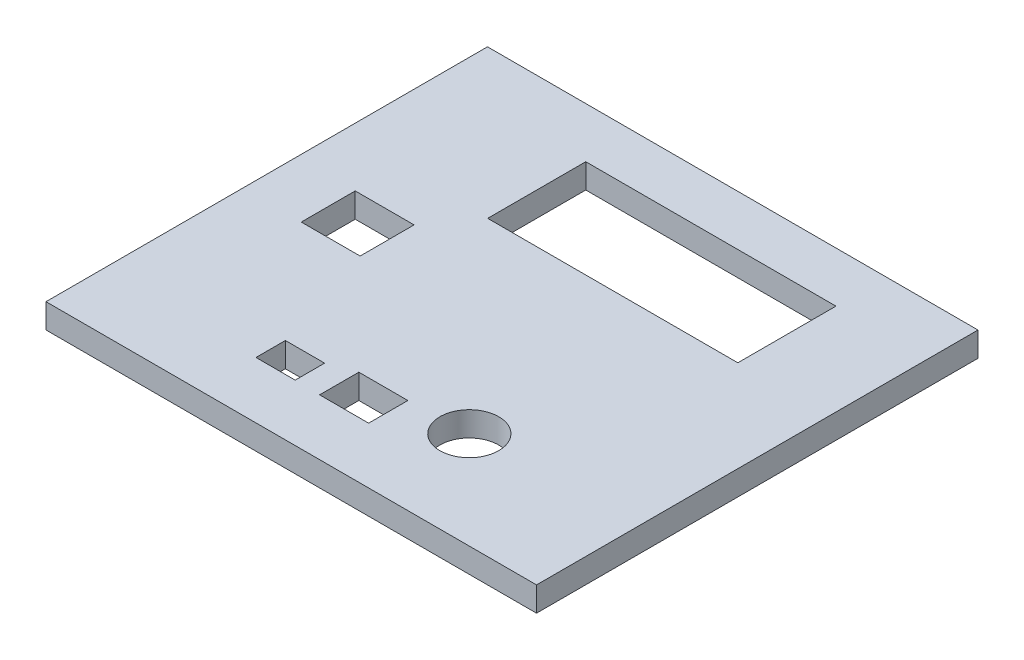
ISO-10303-21;
HEADER;
FILE_DESCRIPTION(('STEP AP214'),'2;1');
FILE_NAME('part.step','',(''),(''),'','','');
FILE_SCHEMA(('AUTOMOTIVE_DESIGN { 1 0 10303 214 1 1 1 1 }'));
ENDSEC;
DATA;
#1=APPLICATION_CONTEXT('core data for automotive mechanical design processes');
#2=APPLICATION_PROTOCOL_DEFINITION('international standard','automotive_design',2000,#1);
#3=PRODUCT_CONTEXT('',#1,'mechanical');
#4=PRODUCT('Part','Part','',(#3));
#5=PRODUCT_RELATED_PRODUCT_CATEGORY('part','',(#4));
#6=PRODUCT_DEFINITION_FORMATION('','',#4);
#7=PRODUCT_DEFINITION_CONTEXT('part definition',#1,'design');
#8=PRODUCT_DEFINITION('design','',#6,#7);
#9=PRODUCT_DEFINITION_SHAPE('','',#8);
#10=(LENGTH_UNIT() NAMED_UNIT(*) SI_UNIT(.MILLI.,.METRE.));
#11=(NAMED_UNIT(*) PLANE_ANGLE_UNIT() SI_UNIT($,.RADIAN.));
#12=(NAMED_UNIT(*) SI_UNIT($,.STERADIAN.) SOLID_ANGLE_UNIT());
#13=UNCERTAINTY_MEASURE_WITH_UNIT(LENGTH_MEASURE(1.E-05),#10,'distance_accuracy_value','');
#14=(GEOMETRIC_REPRESENTATION_CONTEXT(3) GLOBAL_UNCERTAINTY_ASSIGNED_CONTEXT((#13)) GLOBAL_UNIT_ASSIGNED_CONTEXT((#10,
#11,#12)) REPRESENTATION_CONTEXT('',''));
#15=CARTESIAN_POINT('',(0.,0.,0.));
#16=DIRECTION('',(0.,0.,1.));
#17=DIRECTION('',(1.,0.,0.));
#18=AXIS2_PLACEMENT_3D('',#15,#16,#17);
#19=CARTESIAN_POINT('',(0.,5.,0.));
#20=DIRECTION('',(0.,-1.,0.));
#21=DIRECTION('',(0.,0.,-1.));
#22=AXIS2_PLACEMENT_3D('',#19,#20,#21);
#23=PLANE('',#22);
#24=DIRECTION('',(1.,0.,0.));
#25=VECTOR('',#24,1.);
#26=CARTESIAN_POINT('',(-19.6931100810571,5.,-14.7327112730972));
#27=LINE('',#26,#25);
#28=CARTESIAN_POINT('',(-19.6931100810571,5.,-14.7327112730972));
#29=VERTEX_POINT('',#28);
#30=CARTESIAN_POINT('',(31.3068899189429,5.,-14.7327112730972));
#31=VERTEX_POINT('',#30);
#32=EDGE_CURVE('E193',#29,#31,#27,.T.);
#33=ORIENTED_EDGE('',*,*,#32,.F.);
#34=DIRECTION('',(0.,0.,-1.));
#35=VECTOR('',#34,1.);
#36=CARTESIAN_POINT('',(-19.6931100810571,5.,-14.7327112730972));
#37=LINE('',#36,#35);
#38=CARTESIAN_POINT('',(-19.6931100810571,5.,-34.7327112730972));
#39=VERTEX_POINT('',#38);
#40=EDGE_CURVE('E187',#29,#39,#37,.T.);
#41=ORIENTED_EDGE('',*,*,#40,.T.);
#42=DIRECTION('',(1.,0.,0.));
#43=VECTOR('',#42,1.);
#44=CARTESIAN_POINT('',(-19.6931100810571,5.,-34.7327112730972));
#45=LINE('',#44,#43);
#46=CARTESIAN_POINT('',(31.3068899189429,5.,-34.7327112730972));
#47=VERTEX_POINT('',#46);
#48=EDGE_CURVE('E196',#39,#47,#45,.T.);
#49=ORIENTED_EDGE('',*,*,#48,.T.);
#50=DIRECTION('',(0.,0.,-1.));
#51=VECTOR('',#50,1.);
#52=CARTESIAN_POINT('',(31.3068899189429,5.,-14.7327112730972));
#53=LINE('',#52,#51);
#54=EDGE_CURVE('E201',#31,#47,#53,.T.);
#55=ORIENTED_EDGE('',*,*,#54,.F.);
#56=EDGE_LOOP('',(#33,#41,#49,#55));
#57=FACE_BOUND('',#56,.T.);
#58=DIRECTION('',(1.,0.,0.));
#59=VECTOR('',#58,1.);
#60=CARTESIAN_POINT('',(-18.7489198716913,5.,33.4489582294186));
#61=LINE('',#60,#59);
#62=CARTESIAN_POINT('',(-18.7489198716913,5.,33.4489582294186));
#63=VERTEX_POINT('',#62);
#64=CARTESIAN_POINT('',(-10.7489198716913,5.,33.4489582294186));
#65=VERTEX_POINT('',#64);
#66=EDGE_CURVE('E248',#63,#65,#61,.T.);
#67=ORIENTED_EDGE('',*,*,#66,.F.);
#68=DIRECTION('',(0.,0.,-1.));
#69=VECTOR('',#68,1.);
#70=CARTESIAN_POINT('',(-18.7489198716913,5.,33.4489582294186));
#71=LINE('',#70,#69);
#72=CARTESIAN_POINT('',(-18.7489198716913,5.,27.4489582294186));
#73=VERTEX_POINT('',#72);
#74=EDGE_CURVE('E262',#63,#73,#71,.T.);
#75=ORIENTED_EDGE('',*,*,#74,.T.);
#76=DIRECTION('',(1.,0.,0.));
#77=VECTOR('',#76,1.);
#78=CARTESIAN_POINT('',(-18.7489198716913,5.,27.4489582294186));
#79=LINE('',#78,#77);
#80=CARTESIAN_POINT('',(-10.7489198716913,5.,27.4489582294186));
#81=VERTEX_POINT('',#80);
#82=EDGE_CURVE('E276',#73,#81,#79,.T.);
#83=ORIENTED_EDGE('',*,*,#82,.T.);
#84=DIRECTION('',(0.,0.,-1.));
#85=VECTOR('',#84,1.);
#86=CARTESIAN_POINT('',(-10.7489198716913,5.,33.4489582294186));
#87=LINE('',#86,#85);
#88=EDGE_CURVE('E273',#65,#81,#87,.T.);
#89=ORIENTED_EDGE('',*,*,#88,.F.);
#90=EDGE_LOOP('',(#67,#75,#83,#89));
#91=FACE_BOUND('',#90,.T.);
#92=DIRECTION('',(1.,0.,0.));
#93=VECTOR('',#92,1.);
#94=CARTESIAN_POINT('',(-5.6651412561945,5.,33.5605778106871));
#95=LINE('',#94,#93);
#96=CARTESIAN_POINT('',(-5.6651412561945,5.,33.5605778106871));
#97=VERTEX_POINT('',#96);
#98=CARTESIAN_POINT('',(4.3348587438055,5.,33.5605778106871));
#99=VERTEX_POINT('',#98);
#100=EDGE_CURVE('E330',#97,#99,#95,.T.);
#101=ORIENTED_EDGE('',*,*,#100,.F.);
#102=DIRECTION('',(0.,0.,-1.));
#103=VECTOR('',#102,1.);
#104=CARTESIAN_POINT('',(-5.6651412561945,5.,33.5605778106871));
#105=LINE('',#104,#103);
#106=CARTESIAN_POINT('',(-5.6651412561945,5.,25.5605778106871));
#107=VERTEX_POINT('',#106);
#108=EDGE_CURVE('E344',#97,#107,#105,.T.);
#109=ORIENTED_EDGE('',*,*,#108,.T.);
#110=DIRECTION('',(1.,0.,0.));
#111=VECTOR('',#110,1.);
#112=CARTESIAN_POINT('',(-5.6651412561945,5.,25.5605778106871));
#113=LINE('',#112,#111);
#114=CARTESIAN_POINT('',(4.3348587438055,5.,25.5605778106871));
#115=VERTEX_POINT('',#114);
#116=EDGE_CURVE('E360',#107,#115,#113,.T.);
#117=ORIENTED_EDGE('',*,*,#116,.T.);
#118=DIRECTION('',(0.,0.,-1.));
#119=VECTOR('',#118,1.);
#120=CARTESIAN_POINT('',(4.3348587438055,5.,33.5605778106871));
#121=LINE('',#120,#119);
#122=EDGE_CURVE('E356',#99,#115,#121,.T.);
#123=ORIENTED_EDGE('',*,*,#122,.F.);
#124=EDGE_LOOP('',(#101,#109,#117,#123));
#125=FACE_BOUND('',#124,.T.);
#126=DIRECTION('',(1.,0.,0.));
#127=VECTOR('',#126,1.);
#128=CARTESIAN_POINT('',(-38.0373770058773,5.,4.92327752026423));
#129=LINE('',#128,#127);
#130=CARTESIAN_POINT('',(-38.0373770058773,5.,4.92327752026423));
#131=VERTEX_POINT('',#130);
#132=CARTESIAN_POINT('',(-26.0373770058773,5.,4.92327752026423));
#133=VERTEX_POINT('',#132);
#134=EDGE_CURVE('E287',#131,#133,#129,.T.);
#135=ORIENTED_EDGE('',*,*,#134,.F.);
#136=DIRECTION('',(0.,0.,-1.));
#137=VECTOR('',#136,1.);
#138=CARTESIAN_POINT('',(-38.0373770058773,5.,4.92327752026423));
#139=LINE('',#138,#137);
#140=CARTESIAN_POINT('',(-38.0373770058773,5.,-6.07672247973577));
#141=VERTEX_POINT('',#140);
#142=EDGE_CURVE('E303',#131,#141,#139,.T.);
#143=ORIENTED_EDGE('',*,*,#142,.T.);
#144=DIRECTION('',(1.,0.,0.));
#145=VECTOR('',#144,1.);
#146=CARTESIAN_POINT('',(-38.0373770058773,5.,-6.07672247973577));
#147=LINE('',#146,#145);
#148=CARTESIAN_POINT('',(-26.0373770058773,5.,-6.07672247973577));
#149=VERTEX_POINT('',#148);
#150=EDGE_CURVE('E319',#141,#149,#147,.T.);
#151=ORIENTED_EDGE('',*,*,#150,.T.);
#152=DIRECTION('',(0.,0.,-1.));
#153=VECTOR('',#152,1.);
#154=CARTESIAN_POINT('',(-26.0373770058773,5.,4.92327752026423));
#155=LINE('',#154,#153);
#156=EDGE_CURVE('E315',#133,#149,#155,.T.);
#157=ORIENTED_EDGE('',*,*,#156,.F.);
#158=EDGE_LOOP('',(#135,#143,#151,#157));
#159=FACE_BOUND('',#158,.T.);
#160=DIRECTION('',(0.,0.,-1.));
#161=VECTOR('',#160,1.);
#162=CARTESIAN_POINT('',(-50.,5.,45.));
#163=LINE('',#162,#161);
#164=CARTESIAN_POINT('',(-50.,5.,45.));
#165=VERTEX_POINT('',#164);
#166=CARTESIAN_POINT('',(-50.,5.,-45.));
#167=VERTEX_POINT('',#166);
#168=EDGE_CURVE('E367',#165,#167,#163,.T.);
#169=ORIENTED_EDGE('',*,*,#168,.F.);
#170=DIRECTION('',(1.,0.,0.));
#171=VECTOR('',#170,1.);
#172=CARTESIAN_POINT('',(-50.,5.,45.));
#173=LINE('',#172,#171);
#174=CARTESIAN_POINT('',(50.,5.,45.));
#175=VERTEX_POINT('',#174);
#176=EDGE_CURVE('E379',#165,#175,#173,.T.);
#177=ORIENTED_EDGE('',*,*,#176,.T.);
#178=DIRECTION('',(0.,0.,-1.));
#179=VECTOR('',#178,1.);
#180=CARTESIAN_POINT('',(50.,5.,45.));
#181=LINE('',#180,#179);
#182=CARTESIAN_POINT('',(50.,5.,-45.));
#183=VERTEX_POINT('',#182);
#184=EDGE_CURVE('E376',#175,#183,#181,.T.);
#185=ORIENTED_EDGE('',*,*,#184,.T.);
#186=DIRECTION('',(1.,0.,0.));
#187=VECTOR('',#186,1.);
#188=CARTESIAN_POINT('',(-50.,5.,-45.));
#189=LINE('',#188,#187);
#190=EDGE_CURVE('E371',#167,#183,#189,.T.);
#191=ORIENTED_EDGE('',*,*,#190,.F.);
#192=EDGE_LOOP('',(#169,#177,#185,#191));
#193=FACE_BOUND('',#192,.T.);
#194=CARTESIAN_POINT('',(16.4558865060888,5.,25.155924863816));
#195=DIRECTION('',(0.,1.,0.));
#196=DIRECTION('',(0.,0.,1.));
#197=AXIS2_PLACEMENT_3D('',#194,#195,#196);
#198=CIRCLE('',#197,6.);
#199=CARTESIAN_POINT('',(16.4558865060888,5.,31.155924863816));
#200=VERTEX_POINT('',#199);
#201=EDGE_CURVE('E239',#200,#200,#198,.T.);
#202=ORIENTED_EDGE('',*,*,#201,.F.);
#203=EDGE_LOOP('',(#202));
#204=FACE_BOUND('',#203,.T.);
#205=ADVANCED_FACE('F43',(#57,#91,#125,#159,#193,#204),#23,.F.);
#206=CARTESIAN_POINT('',(0.,0.,0.));
#207=DIRECTION('',(0.,-1.,0.));
#208=DIRECTION('',(0.,0.,-1.));
#209=AXIS2_PLACEMENT_3D('',#206,#207,#208);
#210=PLANE('',#209);
#211=DIRECTION('',(0.,0.,-1.));
#212=VECTOR('',#211,1.);
#213=CARTESIAN_POINT('',(-19.6931100810571,0.,-14.7327112730972));
#214=LINE('',#213,#212);
#215=CARTESIAN_POINT('',(-19.6931100810571,0.,-14.7327112730972));
#216=VERTEX_POINT('',#215);
#217=CARTESIAN_POINT('',(-19.6931100810571,0.,-34.7327112730972));
#218=VERTEX_POINT('',#217);
#219=EDGE_CURVE('E190',#216,#218,#214,.T.);
#220=ORIENTED_EDGE('',*,*,#219,.F.);
#221=DIRECTION('',(1.,0.,0.));
#222=VECTOR('',#221,1.);
#223=CARTESIAN_POINT('',(-19.6931100810571,0.,-14.7327112730972));
#224=LINE('',#223,#222);
#225=CARTESIAN_POINT('',(31.3068899189429,0.,-14.7327112730972));
#226=VERTEX_POINT('',#225);
#227=EDGE_CURVE('E205',#216,#226,#224,.T.);
#228=ORIENTED_EDGE('',*,*,#227,.T.);
#229=DIRECTION('',(0.,0.,-1.));
#230=VECTOR('',#229,1.);
#231=CARTESIAN_POINT('',(31.3068899189429,0.,-14.7327112730972));
#232=LINE('',#231,#230);
#233=CARTESIAN_POINT('',(31.3068899189429,0.,-34.7327112730972));
#234=VERTEX_POINT('',#233);
#235=EDGE_CURVE('E209',#226,#234,#232,.T.);
#236=ORIENTED_EDGE('',*,*,#235,.T.);
#237=DIRECTION('',(1.,0.,0.));
#238=VECTOR('',#237,1.);
#239=CARTESIAN_POINT('',(-19.6931100810571,0.,-34.7327112730972));
#240=LINE('',#239,#238);
#241=EDGE_CURVE('E218',#218,#234,#240,.T.);
#242=ORIENTED_EDGE('',*,*,#241,.F.);
#243=EDGE_LOOP('',(#220,#228,#236,#242));
#244=FACE_BOUND('',#243,.T.);
#245=DIRECTION('',(0.,0.,-1.));
#246=VECTOR('',#245,1.);
#247=CARTESIAN_POINT('',(-18.7489198716913,0.,33.4489582294186));
#248=LINE('',#247,#246);
#249=CARTESIAN_POINT('',(-18.7489198716913,0.,33.4489582294186));
#250=VERTEX_POINT('',#249);
#251=CARTESIAN_POINT('',(-18.7489198716913,0.,27.4489582294186));
#252=VERTEX_POINT('',#251);
#253=EDGE_CURVE('E243',#250,#252,#248,.T.);
#254=ORIENTED_EDGE('',*,*,#253,.F.);
#255=DIRECTION('',(1.,0.,0.));
#256=VECTOR('',#255,1.);
#257=CARTESIAN_POINT('',(-18.7489198716913,0.,33.4489582294186));
#258=LINE('',#257,#256);
#259=CARTESIAN_POINT('',(-10.7489198716913,0.,33.4489582294186));
#260=VERTEX_POINT('',#259);
#261=EDGE_CURVE('E257',#250,#260,#258,.T.);
#262=ORIENTED_EDGE('',*,*,#261,.T.);
#263=DIRECTION('',(0.,0.,-1.));
#264=VECTOR('',#263,1.);
#265=CARTESIAN_POINT('',(-10.7489198716913,0.,33.4489582294186));
#266=LINE('',#265,#264);
#267=CARTESIAN_POINT('',(-10.7489198716913,0.,27.4489582294186));
#268=VERTEX_POINT('',#267);
#269=EDGE_CURVE('E261',#260,#268,#266,.T.);
#270=ORIENTED_EDGE('',*,*,#269,.T.);
#271=DIRECTION('',(1.,0.,0.));
#272=VECTOR('',#271,1.);
#273=CARTESIAN_POINT('',(-18.7489198716913,0.,27.4489582294186));
#274=LINE('',#273,#272);
#275=EDGE_CURVE('E266',#252,#268,#274,.T.);
#276=ORIENTED_EDGE('',*,*,#275,.F.);
#277=EDGE_LOOP('',(#254,#262,#270,#276));
#278=FACE_BOUND('',#277,.T.);
#279=DIRECTION('',(0.,0.,-1.));
#280=VECTOR('',#279,1.);
#281=CARTESIAN_POINT('',(-50.,0.,45.));
#282=LINE('',#281,#280);
#283=CARTESIAN_POINT('',(-50.,0.,45.));
#284=VERTEX_POINT('',#283);
#285=CARTESIAN_POINT('',(-50.,0.,-45.));
#286=VERTEX_POINT('',#285);
#287=EDGE_CURVE('E228',#284,#286,#282,.T.);
#288=ORIENTED_EDGE('',*,*,#287,.T.);
#289=DIRECTION('',(1.,0.,0.));
#290=VECTOR('',#289,1.);
#291=CARTESIAN_POINT('',(-50.,0.,-45.));
#292=LINE('',#291,#290);
#293=CARTESIAN_POINT('',(50.,0.,-45.));
#294=VERTEX_POINT('',#293);
#295=EDGE_CURVE('E385',#286,#294,#292,.T.);
#296=ORIENTED_EDGE('',*,*,#295,.T.);
#297=DIRECTION('',(0.,0.,-1.));
#298=VECTOR('',#297,1.);
#299=CARTESIAN_POINT('',(50.,0.,45.));
#300=LINE('',#299,#298);
#301=CARTESIAN_POINT('',(50.,0.,45.));
#302=VERTEX_POINT('',#301);
#303=EDGE_CURVE('E389',#302,#294,#300,.T.);
#304=ORIENTED_EDGE('',*,*,#303,.F.);
#305=DIRECTION('',(1.,0.,0.));
#306=VECTOR('',#305,1.);
#307=CARTESIAN_POINT('',(-50.,0.,45.));
#308=LINE('',#307,#306);
#309=EDGE_CURVE('E372',#284,#302,#308,.T.);
#310=ORIENTED_EDGE('',*,*,#309,.F.);
#311=EDGE_LOOP('',(#288,#296,#304,#310));
#312=FACE_BOUND('',#311,.T.);
#313=DIRECTION('',(0.,0.,-1.));
#314=VECTOR('',#313,1.);
#315=CARTESIAN_POINT('',(-38.0373770058773,0.,4.92327752026423));
#316=LINE('',#315,#314);
#317=CARTESIAN_POINT('',(-38.0373770058773,0.,4.92327752026423));
#318=VERTEX_POINT('',#317);
#319=CARTESIAN_POINT('',(-38.0373770058773,0.,-6.07672247973577));
#320=VERTEX_POINT('',#319);
#321=EDGE_CURVE('E219',#318,#320,#316,.T.);
#322=ORIENTED_EDGE('',*,*,#321,.F.);
#323=DIRECTION('',(1.,0.,0.));
#324=VECTOR('',#323,1.);
#325=CARTESIAN_POINT('',(-38.0373770058773,0.,4.92327752026423));
#326=LINE('',#325,#324);
#327=CARTESIAN_POINT('',(-26.0373770058773,0.,4.92327752026423));
#328=VERTEX_POINT('',#327);
#329=EDGE_CURVE('E298',#318,#328,#326,.T.);
#330=ORIENTED_EDGE('',*,*,#329,.T.);
#331=DIRECTION('',(0.,0.,-1.));
#332=VECTOR('',#331,1.);
#333=CARTESIAN_POINT('',(-26.0373770058773,0.,4.92327752026423));
#334=LINE('',#333,#332);
#335=CARTESIAN_POINT('',(-26.0373770058773,0.,-6.07672247973577));
#336=VERTEX_POINT('',#335);
#337=EDGE_CURVE('E302',#328,#336,#334,.T.);
#338=ORIENTED_EDGE('',*,*,#337,.T.);
#339=DIRECTION('',(1.,0.,0.));
#340=VECTOR('',#339,1.);
#341=CARTESIAN_POINT('',(-38.0373770058773,0.,-6.07672247973577));
#342=LINE('',#341,#340);
#343=EDGE_CURVE('E307',#320,#336,#342,.T.);
#344=ORIENTED_EDGE('',*,*,#343,.F.);
#345=EDGE_LOOP('',(#322,#330,#338,#344));
#346=FACE_BOUND('',#345,.T.);
#347=DIRECTION('',(0.,0.,-1.));
#348=VECTOR('',#347,1.);
#349=CARTESIAN_POINT('',(-5.6651412561945,0.,33.5605778106871));
#350=LINE('',#349,#348);
#351=CARTESIAN_POINT('',(-5.6651412561945,0.,33.5605778106871));
#352=VERTEX_POINT('',#351);
#353=CARTESIAN_POINT('',(-5.6651412561945,0.,25.5605778106871));
#354=VERTEX_POINT('',#353);
#355=EDGE_CURVE('E297',#352,#354,#350,.T.);
#356=ORIENTED_EDGE('',*,*,#355,.F.);
#357=DIRECTION('',(1.,0.,0.));
#358=VECTOR('',#357,1.);
#359=CARTESIAN_POINT('',(-5.6651412561945,0.,33.5605778106871));
#360=LINE('',#359,#358);
#361=CARTESIAN_POINT('',(4.3348587438055,0.,33.5605778106871));
#362=VERTEX_POINT('',#361);
#363=EDGE_CURVE('E339',#352,#362,#360,.T.);
#364=ORIENTED_EDGE('',*,*,#363,.T.);
#365=DIRECTION('',(0.,0.,-1.));
#366=VECTOR('',#365,1.);
#367=CARTESIAN_POINT('',(4.3348587438055,0.,33.5605778106871));
#368=LINE('',#367,#366);
#369=CARTESIAN_POINT('',(4.3348587438055,0.,25.5605778106871));
#370=VERTEX_POINT('',#369);
#371=EDGE_CURVE('E343',#362,#370,#368,.T.);
#372=ORIENTED_EDGE('',*,*,#371,.T.);
#373=DIRECTION('',(1.,0.,0.));
#374=VECTOR('',#373,1.);
#375=CARTESIAN_POINT('',(-5.6651412561945,0.,25.5605778106871));
#376=LINE('',#375,#374);
#377=EDGE_CURVE('E348',#354,#370,#376,.T.);
#378=ORIENTED_EDGE('',*,*,#377,.F.);
#379=EDGE_LOOP('',(#356,#364,#372,#378));
#380=FACE_BOUND('',#379,.T.);
#381=CARTESIAN_POINT('',(16.4558865060888,0.,25.155924863816));
#382=DIRECTION('',(0.,1.,0.));
#383=DIRECTION('',(0.,0.,1.));
#384=AXIS2_PLACEMENT_3D('',#381,#382,#383);
#385=CIRCLE('',#384,6.);
#386=CARTESIAN_POINT('',(16.4558865060888,0.,31.155924863816));
#387=VERTEX_POINT('',#386);
#388=EDGE_CURVE('E234',#387,#387,#385,.T.);
#389=ORIENTED_EDGE('',*,*,#388,.T.);
#390=EDGE_LOOP('',(#389));
#391=FACE_BOUND('',#390,.T.);
#392=ADVANCED_FACE('F411',(#244,#278,#312,#346,#380,#391),#210,.T.);
#393=CARTESIAN_POINT('',(-50.,5.,45.));
#394=DIRECTION('',(-1.,0.,0.));
#395=DIRECTION('',(0.,0.,1.));
#396=AXIS2_PLACEMENT_3D('',#393,#394,#395);
#397=PLANE('',#396);
#398=ORIENTED_EDGE('',*,*,#287,.F.);
#399=DIRECTION('',(0.,-1.,0.));
#400=VECTOR('',#399,1.);
#401=CARTESIAN_POINT('',(-50.,5.,45.));
#402=LINE('',#401,#400);
#403=EDGE_CURVE('E11',#165,#284,#402,.T.);
#404=ORIENTED_EDGE('',*,*,#403,.F.);
#405=ORIENTED_EDGE('',*,*,#168,.T.);
#406=DIRECTION('',(0.,-1.,0.));
#407=VECTOR('',#406,1.);
#408=CARTESIAN_POINT('',(-50.,5.,-45.));
#409=LINE('',#408,#407);
#410=EDGE_CURVE('E47',#167,#286,#409,.T.);
#411=ORIENTED_EDGE('',*,*,#410,.T.);
#412=EDGE_LOOP('',(#398,#404,#405,#411));
#413=FACE_BOUND('',#412,.T.);
#414=ADVANCED_FACE('F45',(#413),#397,.T.);
#415=CARTESIAN_POINT('',(-50.,5.,45.));
#416=DIRECTION('',(0.,0.,-1.));
#417=DIRECTION('',(-1.,0.,0.));
#418=AXIS2_PLACEMENT_3D('',#415,#416,#417);
#419=PLANE('',#418);
#420=ORIENTED_EDGE('',*,*,#309,.T.);
#421=DIRECTION('',(0.,-1.,0.));
#422=VECTOR('',#421,1.);
#423=CARTESIAN_POINT('',(50.,5.,45.));
#424=LINE('',#423,#422);
#425=EDGE_CURVE('E53',#175,#302,#424,.T.);
#426=ORIENTED_EDGE('',*,*,#425,.F.);
#427=ORIENTED_EDGE('',*,*,#176,.F.);
#428=ORIENTED_EDGE('',*,*,#403,.T.);
#429=EDGE_LOOP('',(#420,#426,#427,#428));
#430=FACE_BOUND('',#429,.T.);
#431=ADVANCED_FACE('F415',(#430),#419,.F.);
#432=CARTESIAN_POINT('',(50.,5.,45.));
#433=DIRECTION('',(-1.,0.,0.));
#434=DIRECTION('',(0.,0.,1.));
#435=AXIS2_PLACEMENT_3D('',#432,#433,#434);
#436=PLANE('',#435);
#437=ORIENTED_EDGE('',*,*,#303,.T.);
#438=DIRECTION('',(0.,-1.,0.));
#439=VECTOR('',#438,1.);
#440=CARTESIAN_POINT('',(50.,5.,-45.));
#441=LINE('',#440,#439);
#442=EDGE_CURVE('E397',#183,#294,#441,.T.);
#443=ORIENTED_EDGE('',*,*,#442,.F.);
#444=ORIENTED_EDGE('',*,*,#184,.F.);
#445=ORIENTED_EDGE('',*,*,#425,.T.);
#446=EDGE_LOOP('',(#437,#443,#444,#445));
#447=FACE_BOUND('',#446,.T.);
#448=ADVANCED_FACE('F419',(#447),#436,.F.);
#449=CARTESIAN_POINT('',(-50.,5.,-45.));
#450=DIRECTION('',(0.,0.,-1.));
#451=DIRECTION('',(-1.,0.,0.));
#452=AXIS2_PLACEMENT_3D('',#449,#450,#451);
#453=PLANE('',#452);
#454=ORIENTED_EDGE('',*,*,#295,.F.);
#455=ORIENTED_EDGE('',*,*,#410,.F.);
#456=ORIENTED_EDGE('',*,*,#190,.T.);
#457=ORIENTED_EDGE('',*,*,#442,.T.);
#458=EDGE_LOOP('',(#454,#455,#456,#457));
#459=FACE_BOUND('',#458,.T.);
#460=ADVANCED_FACE('F407',(#459),#453,.T.);
#461=CARTESIAN_POINT('',(-38.0373770058773,5.,4.92327752026423));
#462=DIRECTION('',(-1.,0.,0.));
#463=DIRECTION('',(0.,0.,1.));
#464=AXIS2_PLACEMENT_3D('',#461,#462,#463);
#465=PLANE('',#464);
#466=ORIENTED_EDGE('',*,*,#321,.T.);
#467=DIRECTION('',(0.,-1.,0.));
#468=VECTOR('',#467,1.);
#469=CARTESIAN_POINT('',(-38.0373770058773,5.,-6.07672247973577));
#470=LINE('',#469,#468);
#471=EDGE_CURVE('E283',#141,#320,#470,.T.);
#472=ORIENTED_EDGE('',*,*,#471,.F.);
#473=ORIENTED_EDGE('',*,*,#142,.F.);
#474=DIRECTION('',(0.,-1.,0.));
#475=VECTOR('',#474,1.);
#476=CARTESIAN_POINT('',(-38.0373770058773,5.,4.92327752026423));
#477=LINE('',#476,#475);
#478=EDGE_CURVE('E294',#131,#318,#477,.T.);
#479=ORIENTED_EDGE('',*,*,#478,.T.);
#480=EDGE_LOOP('',(#466,#472,#473,#479));
#481=FACE_BOUND('',#480,.T.);
#482=ADVANCED_FACE('F447',(#481),#465,.F.);
#483=CARTESIAN_POINT('',(-38.0373770058773,5.,4.92327752026423));
#484=DIRECTION('',(0.,0.,-1.));
#485=DIRECTION('',(-1.,0.,0.));
#486=AXIS2_PLACEMENT_3D('',#483,#484,#485);
#487=PLANE('',#486);
#488=ORIENTED_EDGE('',*,*,#329,.F.);
#489=ORIENTED_EDGE('',*,*,#478,.F.);
#490=ORIENTED_EDGE('',*,*,#134,.T.);
#491=DIRECTION('',(0.,-1.,0.));
#492=VECTOR('',#491,1.);
#493=CARTESIAN_POINT('',(-26.0373770058773,5.,4.92327752026423));
#494=LINE('',#493,#492);
#495=EDGE_CURVE('E291',#133,#328,#494,.T.);
#496=ORIENTED_EDGE('',*,*,#495,.T.);
#497=EDGE_LOOP('',(#488,#489,#490,#496));
#498=FACE_BOUND('',#497,.T.);
#499=ADVANCED_FACE('F451',(#498),#487,.T.);
#500=CARTESIAN_POINT('',(-26.0373770058773,5.,4.92327752026423));
#501=DIRECTION('',(-1.,0.,0.));
#502=DIRECTION('',(0.,0.,1.));
#503=AXIS2_PLACEMENT_3D('',#500,#501,#502);
#504=PLANE('',#503);
#505=ORIENTED_EDGE('',*,*,#337,.F.);
#506=ORIENTED_EDGE('',*,*,#495,.F.);
#507=ORIENTED_EDGE('',*,*,#156,.T.);
#508=DIRECTION('',(0.,-1.,0.));
#509=VECTOR('',#508,1.);
#510=CARTESIAN_POINT('',(-26.0373770058773,5.,-6.07672247973577));
#511=LINE('',#510,#509);
#512=EDGE_CURVE('E288',#149,#336,#511,.T.);
#513=ORIENTED_EDGE('',*,*,#512,.T.);
#514=EDGE_LOOP('',(#505,#506,#507,#513));
#515=FACE_BOUND('',#514,.T.);
#516=ADVANCED_FACE('F457',(#515),#504,.T.);
#517=CARTESIAN_POINT('',(-38.0373770058773,5.,-6.07672247973577));
#518=DIRECTION('',(0.,0.,-1.));
#519=DIRECTION('',(-1.,0.,0.));
#520=AXIS2_PLACEMENT_3D('',#517,#518,#519);
#521=PLANE('',#520);
#522=ORIENTED_EDGE('',*,*,#343,.T.);
#523=ORIENTED_EDGE('',*,*,#512,.F.);
#524=ORIENTED_EDGE('',*,*,#150,.F.);
#525=ORIENTED_EDGE('',*,*,#471,.T.);
#526=EDGE_LOOP('',(#522,#523,#524,#525));
#527=FACE_BOUND('',#526,.T.);
#528=ADVANCED_FACE('F464',(#527),#521,.F.);
#529=CARTESIAN_POINT('',(-5.6651412561945,5.,33.5605778106871));
#530=DIRECTION('',(-1.,0.,0.));
#531=DIRECTION('',(0.,0.,1.));
#532=AXIS2_PLACEMENT_3D('',#529,#530,#531);
#533=PLANE('',#532);
#534=ORIENTED_EDGE('',*,*,#355,.T.);
#535=DIRECTION('',(0.,-1.,0.));
#536=VECTOR('',#535,1.);
#537=CARTESIAN_POINT('',(-5.6651412561945,5.,25.5605778106871));
#538=LINE('',#537,#536);
#539=EDGE_CURVE('E326',#107,#354,#538,.T.);
#540=ORIENTED_EDGE('',*,*,#539,.F.);
#541=ORIENTED_EDGE('',*,*,#108,.F.);
#542=DIRECTION('',(0.,-1.,0.));
#543=VECTOR('',#542,1.);
#544=CARTESIAN_POINT('',(-5.6651412561945,5.,33.5605778106871));
#545=LINE('',#544,#543);
#546=EDGE_CURVE('E238',#97,#352,#545,.T.);
#547=ORIENTED_EDGE('',*,*,#546,.T.);
#548=EDGE_LOOP('',(#534,#540,#541,#547));
#549=FACE_BOUND('',#548,.T.);
#550=ADVANCED_FACE('F467',(#549),#533,.F.);
#551=CARTESIAN_POINT('',(-5.6651412561945,5.,33.5605778106871));
#552=DIRECTION('',(0.,0.,-1.));
#553=DIRECTION('',(-1.,0.,0.));
#554=AXIS2_PLACEMENT_3D('',#551,#552,#553);
#555=PLANE('',#554);
#556=ORIENTED_EDGE('',*,*,#363,.F.);
#557=ORIENTED_EDGE('',*,*,#546,.F.);
#558=ORIENTED_EDGE('',*,*,#100,.T.);
#559=DIRECTION('',(0.,-1.,0.));
#560=VECTOR('',#559,1.);
#561=CARTESIAN_POINT('',(4.3348587438055,5.,33.5605778106871));
#562=LINE('',#561,#560);
#563=EDGE_CURVE('E334',#99,#362,#562,.T.);
#564=ORIENTED_EDGE('',*,*,#563,.T.);
#565=EDGE_LOOP('',(#556,#557,#558,#564));
#566=FACE_BOUND('',#565,.T.);
#567=ADVANCED_FACE('F474',(#566),#555,.T.);
#568=CARTESIAN_POINT('',(4.3348587438055,5.,33.5605778106871));
#569=DIRECTION('',(-1.,0.,0.));
#570=DIRECTION('',(0.,0.,1.));
#571=AXIS2_PLACEMENT_3D('',#568,#569,#570);
#572=PLANE('',#571);
#573=ORIENTED_EDGE('',*,*,#371,.F.);
#574=ORIENTED_EDGE('',*,*,#563,.F.);
#575=ORIENTED_EDGE('',*,*,#122,.T.);
#576=DIRECTION('',(0.,-1.,0.));
#577=VECTOR('',#576,1.);
#578=CARTESIAN_POINT('',(4.3348587438055,5.,25.5605778106871));
#579=LINE('',#578,#577);
#580=EDGE_CURVE('E331',#115,#370,#579,.T.);
#581=ORIENTED_EDGE('',*,*,#580,.T.);
#582=EDGE_LOOP('',(#573,#574,#575,#581));
#583=FACE_BOUND('',#582,.T.);
#584=ADVANCED_FACE('F478',(#583),#572,.T.);
#585=CARTESIAN_POINT('',(-5.6651412561945,5.,25.5605778106871));
#586=DIRECTION('',(0.,0.,-1.));
#587=DIRECTION('',(-1.,0.,0.));
#588=AXIS2_PLACEMENT_3D('',#585,#586,#587);
#589=PLANE('',#588);
#590=ORIENTED_EDGE('',*,*,#377,.T.);
#591=ORIENTED_EDGE('',*,*,#580,.F.);
#592=ORIENTED_EDGE('',*,*,#116,.F.);
#593=ORIENTED_EDGE('',*,*,#539,.T.);
#594=EDGE_LOOP('',(#590,#591,#592,#593));
#595=FACE_BOUND('',#594,.T.);
#596=ADVANCED_FACE('F430',(#595),#589,.F.);
#597=CARTESIAN_POINT('',(16.4558865060888,5.,25.155924863816));
#598=DIRECTION('',(0.,-1.,0.));
#599=DIRECTION('',(0.,0.,-1.));
#600=AXIS2_PLACEMENT_3D('',#597,#598,#599);
#601=CYLINDRICAL_SURFACE('',#600,6.);
#602=ORIENTED_EDGE('',*,*,#201,.T.);
#603=EDGE_LOOP('',(#602));
#604=FACE_BOUND('',#603,.T.);
#605=ORIENTED_EDGE('',*,*,#388,.F.);
#606=EDGE_LOOP('',(#605));
#607=FACE_BOUND('',#606,.T.);
#608=ADVANCED_FACE('F426',(#604,#607),#601,.F.);
#609=CARTESIAN_POINT('',(-18.7489198716913,5.,33.4489582294186));
#610=DIRECTION('',(-1.,0.,0.));
#611=DIRECTION('',(0.,0.,1.));
#612=AXIS2_PLACEMENT_3D('',#609,#610,#611);
#613=PLANE('',#612);
#614=ORIENTED_EDGE('',*,*,#253,.T.);
#615=DIRECTION('',(0.,-1.,0.));
#616=VECTOR('',#615,1.);
#617=CARTESIAN_POINT('',(-18.7489198716913,5.,27.4489582294186));
#618=LINE('',#617,#616);
#619=EDGE_CURVE('E244',#73,#252,#618,.T.);
#620=ORIENTED_EDGE('',*,*,#619,.F.);
#621=ORIENTED_EDGE('',*,*,#74,.F.);
#622=DIRECTION('',(0.,-1.,0.));
#623=VECTOR('',#622,1.);
#624=CARTESIAN_POINT('',(-18.7489198716913,5.,33.4489582294186));
#625=LINE('',#624,#623);
#626=EDGE_CURVE('E254',#63,#250,#625,.T.);
#627=ORIENTED_EDGE('',*,*,#626,.T.);
#628=EDGE_LOOP('',(#614,#620,#621,#627));
#629=FACE_BOUND('',#628,.T.);
#630=ADVANCED_FACE('F429',(#629),#613,.F.);
#631=CARTESIAN_POINT('',(-18.7489198716913,5.,33.4489582294186));
#632=DIRECTION('',(0.,0.,-1.));
#633=DIRECTION('',(-1.,0.,0.));
#634=AXIS2_PLACEMENT_3D('',#631,#632,#633);
#635=PLANE('',#634);
#636=ORIENTED_EDGE('',*,*,#261,.F.);
#637=ORIENTED_EDGE('',*,*,#626,.F.);
#638=ORIENTED_EDGE('',*,*,#66,.T.);
#639=DIRECTION('',(0.,-1.,0.));
#640=VECTOR('',#639,1.);
#641=CARTESIAN_POINT('',(-10.7489198716913,5.,33.4489582294186));
#642=LINE('',#641,#640);
#643=EDGE_CURVE('E251',#65,#260,#642,.T.);
#644=ORIENTED_EDGE('',*,*,#643,.T.);
#645=EDGE_LOOP('',(#636,#637,#638,#644));
#646=FACE_BOUND('',#645,.T.);
#647=ADVANCED_FACE('F462',(#646),#635,.T.);
#648=CARTESIAN_POINT('',(-10.7489198716913,5.,33.4489582294186));
#649=DIRECTION('',(-1.,0.,0.));
#650=DIRECTION('',(0.,0.,1.));
#651=AXIS2_PLACEMENT_3D('',#648,#649,#650);
#652=PLANE('',#651);
#653=ORIENTED_EDGE('',*,*,#269,.F.);
#654=ORIENTED_EDGE('',*,*,#643,.F.);
#655=ORIENTED_EDGE('',*,*,#88,.T.);
#656=DIRECTION('',(0.,-1.,0.));
#657=VECTOR('',#656,1.);
#658=CARTESIAN_POINT('',(-10.7489198716913,5.,27.4489582294186));
#659=LINE('',#658,#657);
#660=EDGE_CURVE('E69',#81,#268,#659,.T.);
#661=ORIENTED_EDGE('',*,*,#660,.T.);
#662=EDGE_LOOP('',(#653,#654,#655,#661));
#663=FACE_BOUND('',#662,.T.);
#664=ADVANCED_FACE('F534',(#663),#652,.T.);
#665=CARTESIAN_POINT('',(-18.7489198716913,5.,27.4489582294186));
#666=DIRECTION('',(0.,0.,-1.));
#667=DIRECTION('',(-1.,0.,0.));
#668=AXIS2_PLACEMENT_3D('',#665,#666,#667);
#669=PLANE('',#668);
#670=ORIENTED_EDGE('',*,*,#275,.T.);
#671=ORIENTED_EDGE('',*,*,#660,.F.);
#672=ORIENTED_EDGE('',*,*,#82,.F.);
#673=ORIENTED_EDGE('',*,*,#619,.T.);
#674=EDGE_LOOP('',(#670,#671,#672,#673));
#675=FACE_BOUND('',#674,.T.);
#676=ADVANCED_FACE('F541',(#675),#669,.F.);
#677=CARTESIAN_POINT('',(-19.6931100810571,5.,-14.7327112730972));
#678=DIRECTION('',(-1.,0.,0.));
#679=DIRECTION('',(0.,0.,1.));
#680=AXIS2_PLACEMENT_3D('',#677,#678,#679);
#681=PLANE('',#680);
#682=ORIENTED_EDGE('',*,*,#219,.T.);
#683=DIRECTION('',(0.,-1.,0.));
#684=VECTOR('',#683,1.);
#685=CARTESIAN_POINT('',(-19.6931100810571,5.,-34.7327112730972));
#686=LINE('',#685,#684);
#687=EDGE_CURVE('E184',#39,#218,#686,.T.);
#688=ORIENTED_EDGE('',*,*,#687,.F.);
#689=ORIENTED_EDGE('',*,*,#40,.F.);
#690=DIRECTION('',(0.,-1.,0.));
#691=VECTOR('',#690,1.);
#692=CARTESIAN_POINT('',(-19.6931100810571,5.,-14.7327112730972));
#693=LINE('',#692,#691);
#694=EDGE_CURVE('E225',#29,#216,#693,.T.);
#695=ORIENTED_EDGE('',*,*,#694,.T.);
#696=EDGE_LOOP('',(#682,#688,#689,#695));
#697=FACE_BOUND('',#696,.T.);
#698=ADVANCED_FACE('F185',(#697),#681,.F.);
#699=CARTESIAN_POINT('',(-19.6931100810571,5.,-14.7327112730972));
#700=DIRECTION('',(0.,0.,-1.));
#701=DIRECTION('',(-1.,0.,0.));
#702=AXIS2_PLACEMENT_3D('',#699,#700,#701);
#703=PLANE('',#702);
#704=ORIENTED_EDGE('',*,*,#227,.F.);
#705=ORIENTED_EDGE('',*,*,#694,.F.);
#706=ORIENTED_EDGE('',*,*,#32,.T.);
#707=DIRECTION('',(0.,-1.,0.));
#708=VECTOR('',#707,1.);
#709=CARTESIAN_POINT('',(31.3068899189429,5.,-14.7327112730972));
#710=LINE('',#709,#708);
#711=EDGE_CURVE('E229',#31,#226,#710,.T.);
#712=ORIENTED_EDGE('',*,*,#711,.T.);
#713=EDGE_LOOP('',(#704,#705,#706,#712));
#714=FACE_BOUND('',#713,.T.);
#715=ADVANCED_FACE('F554',(#714),#703,.T.);
#716=CARTESIAN_POINT('',(31.3068899189429,5.,-14.7327112730972));
#717=DIRECTION('',(-1.,0.,0.));
#718=DIRECTION('',(0.,0.,1.));
#719=AXIS2_PLACEMENT_3D('',#716,#717,#718);
#720=PLANE('',#719);
#721=ORIENTED_EDGE('',*,*,#235,.F.);
#722=ORIENTED_EDGE('',*,*,#711,.F.);
#723=ORIENTED_EDGE('',*,*,#54,.T.);
#724=DIRECTION('',(0.,-1.,0.));
#725=VECTOR('',#724,1.);
#726=CARTESIAN_POINT('',(31.3068899189429,5.,-34.7327112730972));
#727=LINE('',#726,#725);
#728=EDGE_CURVE('E61',#47,#234,#727,.T.);
#729=ORIENTED_EDGE('',*,*,#728,.T.);
#730=EDGE_LOOP('',(#721,#722,#723,#729));
#731=FACE_BOUND('',#730,.T.);
#732=ADVANCED_FACE('F561',(#731),#720,.T.);
#733=CARTESIAN_POINT('',(-19.6931100810571,5.,-34.7327112730972));
#734=DIRECTION('',(0.,0.,-1.));
#735=DIRECTION('',(-1.,0.,0.));
#736=AXIS2_PLACEMENT_3D('',#733,#734,#735);
#737=PLANE('',#736);
#738=ORIENTED_EDGE('',*,*,#241,.T.);
#739=ORIENTED_EDGE('',*,*,#728,.F.);
#740=ORIENTED_EDGE('',*,*,#48,.F.);
#741=ORIENTED_EDGE('',*,*,#687,.T.);
#742=EDGE_LOOP('',(#738,#739,#740,#741));
#743=FACE_BOUND('',#742,.T.);
#744=ADVANCED_FACE('F197',(#743),#737,.F.);
#745=CLOSED_SHELL('',(#205,#392,#414,#431,#448,#460,#482,#499,#516,#528,#550,#567,#584,#596,
#608,#630,#647,#664,#676,#698,#715,#732,#744));
#746=MANIFOLD_SOLID_BREP('B2',#745);
#747=ADVANCED_BREP_SHAPE_REPRESENTATION('',(#18,#746),#14);
#748=SHAPE_DEFINITION_REPRESENTATION(#9,#747);
ENDSEC;
END-ISO-10303-21;
